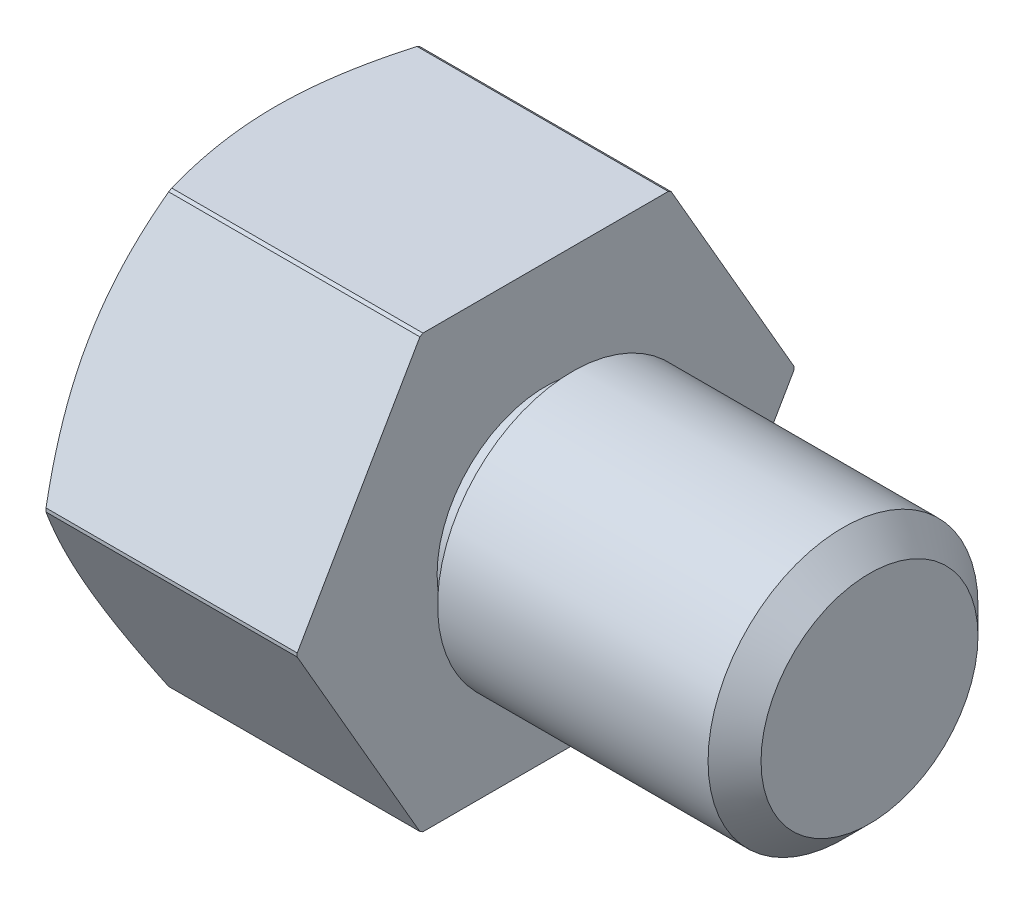
ISO-10303-21;
HEADER;
FILE_DESCRIPTION(('STEP AP214'),'2;1');
FILE_NAME('part.step','',(''),(''),'','','');
FILE_SCHEMA(('AUTOMOTIVE_DESIGN { 1 0 10303 214 1 1 1 1 }'));
ENDSEC;
DATA;
#1=APPLICATION_CONTEXT('core data for automotive mechanical design processes');
#2=APPLICATION_PROTOCOL_DEFINITION('international standard','automotive_design',2000,#1);
#3=PRODUCT_CONTEXT('',#1,'mechanical');
#4=PRODUCT('Part','Part','',(#3));
#5=PRODUCT_RELATED_PRODUCT_CATEGORY('part','',(#4));
#6=PRODUCT_DEFINITION_FORMATION('','',#4);
#7=PRODUCT_DEFINITION_CONTEXT('part definition',#1,'design');
#8=PRODUCT_DEFINITION('design','',#6,#7);
#9=PRODUCT_DEFINITION_SHAPE('','',#8);
#10=(LENGTH_UNIT() NAMED_UNIT(*) SI_UNIT(.MILLI.,.METRE.));
#11=(NAMED_UNIT(*) PLANE_ANGLE_UNIT() SI_UNIT($,.RADIAN.));
#12=(NAMED_UNIT(*) SI_UNIT($,.STERADIAN.) SOLID_ANGLE_UNIT());
#13=UNCERTAINTY_MEASURE_WITH_UNIT(LENGTH_MEASURE(1.E-05),#10,'distance_accuracy_value','');
#14=(GEOMETRIC_REPRESENTATION_CONTEXT(3) GLOBAL_UNCERTAINTY_ASSIGNED_CONTEXT((#13)) GLOBAL_UNIT_ASSIGNED_CONTEXT((#10,
#11,#12)) REPRESENTATION_CONTEXT('',''));
#15=CARTESIAN_POINT('',(0.,0.,0.));
#16=DIRECTION('',(0.,0.,1.));
#17=DIRECTION('',(1.,0.,0.));
#18=AXIS2_PLACEMENT_3D('',#15,#16,#17);
#19=CARTESIAN_POINT('',(6.,1.00475,0.));
#20=DIRECTION('',(1.,0.,0.));
#21=DIRECTION('',(0.,0.,-1.));
#22=AXIS2_PLACEMENT_3D('',#19,#20,#21);
#23=PLANE('',#22);
#24=CARTESIAN_POINT('',(6.00000000002865,0.,0.));
#25=DIRECTION('',(-1.,0.,0.));
#26=DIRECTION('',(0.,0.,1.));
#27=AXIS2_PLACEMENT_3D('',#24,#25,#26);
#28=CIRCLE('',#27,2.00949999998556);
#29=CARTESIAN_POINT('',(6.00000000002865,0.,2.00949999998556));
#30=VERTEX_POINT('',#29);
#31=EDGE_CURVE('E20',#30,#30,#28,.T.);
#32=ORIENTED_EDGE('',*,*,#31,.F.);
#33=EDGE_LOOP('',(#32));
#34=FACE_BOUND('',#33,.T.);
#35=ADVANCED_FACE('F17',(#34),#23,.T.);
#36=CARTESIAN_POINT('',(5.50950000007333,0.,0.));
#37=DIRECTION('',(-1.,0.,0.));
#38=DIRECTION('',(0.,0.,1.));
#39=AXIS2_PLACEMENT_3D('',#36,#37,#38);
#40=CONICAL_SURFACE('',#39,2.49999999999773,0.785398163455393);
#41=CARTESIAN_POINT('',(5.5095,0.,0.));
#42=DIRECTION('',(1.,0.,0.));
#43=DIRECTION('',(0.,0.,-1.));
#44=AXIS2_PLACEMENT_3D('',#41,#42,#43);
#45=CIRCLE('',#44,2.5);
#46=CARTESIAN_POINT('',(5.5095,0.,-2.5));
#47=VERTEX_POINT('',#46);
#48=EDGE_CURVE('E184',#47,#47,#45,.F.);
#49=ORIENTED_EDGE('',*,*,#48,.F.);
#50=EDGE_LOOP('',(#49));
#51=FACE_BOUND('',#50,.T.);
#52=ORIENTED_EDGE('',*,*,#31,.T.);
#53=EDGE_LOOP('',(#52));
#54=FACE_BOUND('',#53,.T.);
#55=ADVANCED_FACE('F341',(#51,#54),#40,.T.);
#56=CARTESIAN_POINT('',(3.00475,0.,0.));
#57=DIRECTION('',(1.,0.,0.));
#58=DIRECTION('',(0.,0.,-1.));
#59=AXIS2_PLACEMENT_3D('',#56,#57,#58);
#60=CYLINDRICAL_SURFACE('',#59,2.5);
#61=CARTESIAN_POINT('',(0.5,0.,0.));
#62=DIRECTION('',(1.,0.,0.));
#63=DIRECTION('',(0.,0.,-1.));
#64=AXIS2_PLACEMENT_3D('',#61,#62,#63);
#65=CIRCLE('',#64,2.5);
#66=CARTESIAN_POINT('',(0.5,0.,-2.5));
#67=VERTEX_POINT('',#66);
#68=EDGE_CURVE('E186',#67,#67,#65,.F.);
#69=ORIENTED_EDGE('',*,*,#68,.F.);
#70=EDGE_LOOP('',(#69));
#71=FACE_BOUND('',#70,.T.);
#72=ORIENTED_EDGE('',*,*,#48,.T.);
#73=EDGE_LOOP('',(#72));
#74=FACE_BOUND('',#73,.T.);
#75=ADVANCED_FACE('F338',(#71,#74),#60,.T.);
#76=CARTESIAN_POINT('',(0.5,2.25475,0.));
#77=DIRECTION('',(-1.,0.,0.));
#78=DIRECTION('',(0.,-1.,0.));
#79=AXIS2_PLACEMENT_3D('',#76,#77,#78);
#80=PLANE('',#79);
#81=ORIENTED_EDGE('',*,*,#68,.T.);
#82=EDGE_LOOP('',(#81));
#83=FACE_BOUND('',#82,.T.);
#84=CARTESIAN_POINT('',(0.5,0.,0.));
#85=DIRECTION('',(1.,0.,0.));
#86=DIRECTION('',(0.,0.,-1.));
#87=AXIS2_PLACEMENT_3D('',#84,#85,#86);
#88=CIRCLE('',#87,2.0095);
#89=CARTESIAN_POINT('',(0.5,0.,-2.0095));
#90=VERTEX_POINT('',#89);
#91=EDGE_CURVE('E181',#90,#90,#88,.F.);
#92=ORIENTED_EDGE('',*,*,#91,.F.);
#93=EDGE_LOOP('',(#92));
#94=FACE_BOUND('',#93,.T.);
#95=ADVANCED_FACE('F335',(#83,#94),#80,.T.);
#96=CARTESIAN_POINT('',(0.25,0.,0.));
#97=DIRECTION('',(1.,0.,0.));
#98=DIRECTION('',(0.,0.,-1.));
#99=AXIS2_PLACEMENT_3D('',#96,#97,#98);
#100=CYLINDRICAL_SURFACE('',#99,2.0095);
#101=CARTESIAN_POINT('',(0.,0.,0.));
#102=DIRECTION('',(1.,0.,0.));
#103=DIRECTION('',(0.,0.,-1.));
#104=AXIS2_PLACEMENT_3D('',#101,#102,#103);
#105=CIRCLE('',#104,2.0095);
#106=CARTESIAN_POINT('',(0.,0.,-2.0095));
#107=VERTEX_POINT('',#106);
#108=EDGE_CURVE('E153',#107,#107,#105,.F.);
#109=ORIENTED_EDGE('',*,*,#108,.F.);
#110=EDGE_LOOP('',(#109));
#111=FACE_BOUND('',#110,.T.);
#112=ORIENTED_EDGE('',*,*,#91,.T.);
#113=EDGE_LOOP('',(#112));
#114=FACE_BOUND('',#113,.T.);
#115=ADVANCED_FACE('F485',(#111,#114),#100,.T.);
#116=CARTESIAN_POINT('',(-2.32679491924311,0.,0.));
#117=DIRECTION('',(1.,0.,0.));
#118=DIRECTION('',(0.,0.,-1.));
#119=AXIS2_PLACEMENT_3D('',#116,#117,#118);
#120=CYLINDRICAL_SURFACE('',#119,4.6);
#121=DIRECTION('',(1.,0.,0.));
#122=VECTOR('',#121,1.);
#123=CARTESIAN_POINT('',(-5.,-0.0327684427093968,-4.59988328429781));
#124=LINE('',#123,#122);
#125=CARTESIAN_POINT('',(0.,-0.0327684427093948,-4.59988328429781));
#126=VERTEX_POINT('',#125);
#127=CARTESIAN_POINT('',(-4.65358983850798,-0.0327684427093944,-4.59988328429781));
#128=VERTEX_POINT('',#127);
#129=EDGE_CURVE('E182',#126,#128,#124,.F.);
#130=ORIENTED_EDGE('',*,*,#129,.T.);
#131=CARTESIAN_POINT('',(-4.65358983848622,0.,0.));
#132=DIRECTION('',(1.,0.,0.));
#133=DIRECTION('',(0.,0.,-1.));
#134=AXIS2_PLACEMENT_3D('',#131,#132,#133);
#135=CIRCLE('',#134,4.6);
#136=CARTESIAN_POINT('',(-4.65358983850798,0.0327684427094049,-4.59988328429781));
#137=VERTEX_POINT('',#136);
#138=EDGE_CURVE('E174',#128,#137,#135,.T.);
#139=ORIENTED_EDGE('',*,*,#138,.T.);
#140=DIRECTION('',(1.,0.,0.));
#141=VECTOR('',#140,1.);
#142=CARTESIAN_POINT('',(-5.,0.0327684427094017,-4.59988328429781));
#143=LINE('',#142,#141);
#144=CARTESIAN_POINT('',(0.,0.0327684427094049,-4.59988328429781));
#145=VERTEX_POINT('',#144);
#146=EDGE_CURVE('E137',#137,#145,#143,.T.);
#147=ORIENTED_EDGE('',*,*,#146,.T.);
#148=CARTESIAN_POINT('',(0.,0.,0.));
#149=DIRECTION('',(1.,0.,0.));
#150=DIRECTION('',(0.,0.,-1.));
#151=AXIS2_PLACEMENT_3D('',#148,#149,#150);
#152=CIRCLE('',#151,4.6);
#153=EDGE_CURVE('E134',#126,#145,#152,.T.);
#154=ORIENTED_EDGE('',*,*,#153,.F.);
#155=EDGE_LOOP('',(#130,#139,#147,#154));
#156=FACE_BOUND('',#155,.T.);
#157=ADVANCED_FACE('F396',(#156),#120,.T.);
#158=CARTESIAN_POINT('',(-2.32679491924311,0.,0.));
#159=DIRECTION('',(1.,0.,0.));
#160=DIRECTION('',(0.,0.,-1.));
#161=AXIS2_PLACEMENT_3D('',#158,#159,#160);
#162=CYLINDRICAL_SURFACE('',#161,4.6);
#163=DIRECTION('',(1.,0.,0.));
#164=VECTOR('',#163,1.);
#165=CARTESIAN_POINT('',(-5.,-3.9672315572906,-2.3283199459777));
#166=LINE('',#165,#164);
#167=CARTESIAN_POINT('',(-4.65358983850798,-3.9672315572906,-2.3283199459777));
#168=VERTEX_POINT('',#167);
#169=CARTESIAN_POINT('',(0.,-3.9672315572906,-2.3283199459777));
#170=VERTEX_POINT('',#169);
#171=EDGE_CURVE('E142',#168,#170,#166,.T.);
#172=ORIENTED_EDGE('',*,*,#171,.T.);
#173=CARTESIAN_POINT('',(0.,0.,0.));
#174=DIRECTION('',(1.,0.,0.));
#175=DIRECTION('',(0.,0.,-1.));
#176=AXIS2_PLACEMENT_3D('',#173,#174,#175);
#177=CIRCLE('',#176,4.6);
#178=CARTESIAN_POINT('',(0.,-4.,-2.27156333832011));
#179=VERTEX_POINT('',#178);
#180=EDGE_CURVE('E323',#179,#170,#177,.T.);
#181=ORIENTED_EDGE('',*,*,#180,.F.);
#182=DIRECTION('',(1.,0.,0.));
#183=VECTOR('',#182,1.);
#184=CARTESIAN_POINT('',(-5.,-4.,-2.27156333832011));
#185=LINE('',#184,#183);
#186=CARTESIAN_POINT('',(-4.65358983850798,-4.,-2.27156333832011));
#187=VERTEX_POINT('',#186);
#188=EDGE_CURVE('E178',#179,#187,#185,.F.);
#189=ORIENTED_EDGE('',*,*,#188,.T.);
#190=CARTESIAN_POINT('',(-4.65358983848622,0.,0.));
#191=DIRECTION('',(1.,0.,0.));
#192=DIRECTION('',(0.,0.,-1.));
#193=AXIS2_PLACEMENT_3D('',#190,#191,#192);
#194=CIRCLE('',#193,4.6);
#195=EDGE_CURVE('E167',#187,#168,#194,.T.);
#196=ORIENTED_EDGE('',*,*,#195,.T.);
#197=EDGE_LOOP('',(#172,#181,#189,#196));
#198=FACE_BOUND('',#197,.T.);
#199=ADVANCED_FACE('F470',(#198),#162,.T.);
#200=CARTESIAN_POINT('',(-2.32679491924311,0.,0.));
#201=DIRECTION('',(1.,0.,0.));
#202=DIRECTION('',(0.,0.,-1.));
#203=AXIS2_PLACEMENT_3D('',#200,#201,#202);
#204=CYLINDRICAL_SURFACE('',#203,4.6);
#205=DIRECTION('',(1.,0.,0.));
#206=VECTOR('',#205,1.);
#207=CARTESIAN_POINT('',(-5.,-4.,2.27156333832011));
#208=LINE('',#207,#206);
#209=CARTESIAN_POINT('',(-4.65358983850798,-4.,2.27156333832011));
#210=VERTEX_POINT('',#209);
#211=CARTESIAN_POINT('',(0.,-4.,2.27156333832011));
#212=VERTEX_POINT('',#211);
#213=EDGE_CURVE('E179',#210,#212,#208,.T.);
#214=ORIENTED_EDGE('',*,*,#213,.T.);
#215=CARTESIAN_POINT('',(0.,0.,0.));
#216=DIRECTION('',(1.,0.,0.));
#217=DIRECTION('',(0.,0.,-1.));
#218=AXIS2_PLACEMENT_3D('',#215,#216,#217);
#219=CIRCLE('',#218,4.6);
#220=CARTESIAN_POINT('',(0.,-3.9672315572906,2.32831994597771));
#221=VERTEX_POINT('',#220);
#222=EDGE_CURVE('E326',#221,#212,#219,.T.);
#223=ORIENTED_EDGE('',*,*,#222,.F.);
#224=DIRECTION('',(1.,0.,0.));
#225=VECTOR('',#224,1.);
#226=CARTESIAN_POINT('',(-5.,-3.9672315572906,2.3283199459777));
#227=LINE('',#226,#225);
#228=CARTESIAN_POINT('',(-4.65358983850798,-3.9672315572906,2.32831994597771));
#229=VERTEX_POINT('',#228);
#230=EDGE_CURVE('E171',#221,#229,#227,.F.);
#231=ORIENTED_EDGE('',*,*,#230,.T.);
#232=CARTESIAN_POINT('',(-4.65358983848622,0.,0.));
#233=DIRECTION('',(1.,0.,0.));
#234=DIRECTION('',(0.,0.,-1.));
#235=AXIS2_PLACEMENT_3D('',#232,#233,#234);
#236=CIRCLE('',#235,4.6);
#237=EDGE_CURVE('E165',#229,#210,#236,.T.);
#238=ORIENTED_EDGE('',*,*,#237,.T.);
#239=EDGE_LOOP('',(#214,#223,#231,#238));
#240=FACE_BOUND('',#239,.T.);
#241=ADVANCED_FACE('F463',(#240),#204,.T.);
#242=CARTESIAN_POINT('',(-2.32679491924311,0.,0.));
#243=DIRECTION('',(1.,0.,0.));
#244=DIRECTION('',(0.,0.,-1.));
#245=AXIS2_PLACEMENT_3D('',#242,#243,#244);
#246=CYLINDRICAL_SURFACE('',#245,4.6);
#247=DIRECTION('',(1.,0.,0.));
#248=VECTOR('',#247,1.);
#249=CARTESIAN_POINT('',(-5.,4.,-2.27156333832011));
#250=LINE('',#249,#248);
#251=CARTESIAN_POINT('',(-4.65358983850798,4.,-2.27156333832011));
#252=VERTEX_POINT('',#251);
#253=CARTESIAN_POINT('',(0.,4.,-2.27156333832011));
#254=VERTEX_POINT('',#253);
#255=EDGE_CURVE('E122',#252,#254,#250,.T.);
#256=ORIENTED_EDGE('',*,*,#255,.T.);
#257=CARTESIAN_POINT('',(0.,0.,0.));
#258=DIRECTION('',(1.,0.,0.));
#259=DIRECTION('',(0.,0.,-1.));
#260=AXIS2_PLACEMENT_3D('',#257,#258,#259);
#261=CIRCLE('',#260,4.6);
#262=CARTESIAN_POINT('',(0.,3.9672315572906,-2.32831994597771));
#263=VERTEX_POINT('',#262);
#264=EDGE_CURVE('E115',#263,#254,#261,.T.);
#265=ORIENTED_EDGE('',*,*,#264,.F.);
#266=DIRECTION('',(1.,0.,0.));
#267=VECTOR('',#266,1.);
#268=CARTESIAN_POINT('',(-5.,3.9672315572906,-2.3283199459777));
#269=LINE('',#268,#267);
#270=CARTESIAN_POINT('',(-4.65358983850798,3.9672315572906,-2.32831994597771));
#271=VERTEX_POINT('',#270);
#272=EDGE_CURVE('E119',#263,#271,#269,.F.);
#273=ORIENTED_EDGE('',*,*,#272,.T.);
#274=CARTESIAN_POINT('',(-4.65358983848622,0.,0.));
#275=DIRECTION('',(1.,0.,0.));
#276=DIRECTION('',(0.,0.,-1.));
#277=AXIS2_PLACEMENT_3D('',#274,#275,#276);
#278=CIRCLE('',#277,4.6);
#279=EDGE_CURVE('E160',#271,#252,#278,.T.);
#280=ORIENTED_EDGE('',*,*,#279,.T.);
#281=EDGE_LOOP('',(#256,#265,#273,#280));
#282=FACE_BOUND('',#281,.T.);
#283=ADVANCED_FACE('F117',(#282),#246,.T.);
#284=CARTESIAN_POINT('',(-2.32679491924311,0.,0.));
#285=DIRECTION('',(1.,0.,0.));
#286=DIRECTION('',(0.,0.,-1.));
#287=AXIS2_PLACEMENT_3D('',#284,#285,#286);
#288=CYLINDRICAL_SURFACE('',#287,4.6);
#289=DIRECTION('',(1.,0.,0.));
#290=VECTOR('',#289,1.);
#291=CARTESIAN_POINT('',(-5.,3.9672315572906,2.3283199459777));
#292=LINE('',#291,#290);
#293=CARTESIAN_POINT('',(-4.65358983850798,3.9672315572906,2.3283199459777));
#294=VERTEX_POINT('',#293);
#295=CARTESIAN_POINT('',(0.,3.9672315572906,2.3283199459777));
#296=VERTEX_POINT('',#295);
#297=EDGE_CURVE('E157',#294,#296,#292,.T.);
#298=ORIENTED_EDGE('',*,*,#297,.T.);
#299=CARTESIAN_POINT('',(0.,0.,0.));
#300=DIRECTION('',(1.,0.,0.));
#301=DIRECTION('',(0.,0.,-1.));
#302=AXIS2_PLACEMENT_3D('',#299,#300,#301);
#303=CIRCLE('',#302,4.6);
#304=CARTESIAN_POINT('',(0.,4.,2.27156333832011));
#305=VERTEX_POINT('',#304);
#306=EDGE_CURVE('E126',#305,#296,#303,.T.);
#307=ORIENTED_EDGE('',*,*,#306,.F.);
#308=DIRECTION('',(1.,0.,0.));
#309=VECTOR('',#308,1.);
#310=CARTESIAN_POINT('',(-5.,4.,2.27156333832011));
#311=LINE('',#310,#309);
#312=CARTESIAN_POINT('',(-4.65358983850798,4.,2.27156333832011));
#313=VERTEX_POINT('',#312);
#314=EDGE_CURVE('E163',#305,#313,#311,.F.);
#315=ORIENTED_EDGE('',*,*,#314,.T.);
#316=CARTESIAN_POINT('',(-4.65358983848622,0.,0.));
#317=DIRECTION('',(1.,0.,0.));
#318=DIRECTION('',(0.,0.,-1.));
#319=AXIS2_PLACEMENT_3D('',#316,#317,#318);
#320=CIRCLE('',#319,4.6);
#321=EDGE_CURVE('E127',#313,#294,#320,.T.);
#322=ORIENTED_EDGE('',*,*,#321,.T.);
#323=EDGE_LOOP('',(#298,#307,#315,#322));
#324=FACE_BOUND('',#323,.T.);
#325=ADVANCED_FACE('F411',(#324),#288,.T.);
#326=CARTESIAN_POINT('',(0.,3.30475,0.));
#327=DIRECTION('',(1.,0.,0.));
#328=DIRECTION('',(0.,0.,-1.));
#329=AXIS2_PLACEMENT_3D('',#326,#327,#328);
#330=PLANE('',#329);
#331=ORIENTED_EDGE('',*,*,#108,.T.);
#332=EDGE_LOOP('',(#331));
#333=FACE_BOUND('',#332,.T.);
#334=DIRECTION('',(0.,-0.866025403784439,0.5));
#335=VECTOR('',#334,1.);
#336=CARTESIAN_POINT('',(0.,-4.,-2.3094010767585));
#337=LINE('',#336,#335);
#338=EDGE_CURVE('E144',#170,#126,#337,.F.);
#339=ORIENTED_EDGE('',*,*,#338,.T.);
#340=ORIENTED_EDGE('',*,*,#153,.T.);
#341=DIRECTION('',(0.,-0.866025403784439,-0.5));
#342=VECTOR('',#341,1.);
#343=CARTESIAN_POINT('',(0.,0.,-4.61880215351701));
#344=LINE('',#343,#342);
#345=EDGE_CURVE('E131',#145,#263,#344,.F.);
#346=ORIENTED_EDGE('',*,*,#345,.T.);
#347=ORIENTED_EDGE('',*,*,#264,.T.);
#348=DIRECTION('',(0.,0.,-1.));
#349=VECTOR('',#348,1.);
#350=CARTESIAN_POINT('',(0.,4.,-2.3094010767585));
#351=LINE('',#350,#349);
#352=EDGE_CURVE('E161',#254,#305,#351,.F.);
#353=ORIENTED_EDGE('',*,*,#352,.T.);
#354=ORIENTED_EDGE('',*,*,#306,.T.);
#355=DIRECTION('',(0.,0.866025403784439,-0.5));
#356=VECTOR('',#355,1.);
#357=CARTESIAN_POINT('',(0.,4.,2.3094010767585));
#358=LINE('',#357,#356);
#359=CARTESIAN_POINT('',(0.,0.0327684427093948,4.59988328429781));
#360=VERTEX_POINT('',#359);
#361=EDGE_CURVE('E154',#296,#360,#358,.F.);
#362=ORIENTED_EDGE('',*,*,#361,.T.);
#363=CARTESIAN_POINT('',(0.,0.,0.));
#364=DIRECTION('',(1.,0.,0.));
#365=DIRECTION('',(0.,0.,-1.));
#366=AXIS2_PLACEMENT_3D('',#363,#364,#365);
#367=CIRCLE('',#366,4.6);
#368=CARTESIAN_POINT('',(0.,-0.0327684427094049,4.59988328429781));
#369=VERTEX_POINT('',#368);
#370=EDGE_CURVE('E149',#369,#360,#367,.F.);
#371=ORIENTED_EDGE('',*,*,#370,.F.);
#372=DIRECTION('',(0.,0.866025403784439,0.5));
#373=VECTOR('',#372,1.);
#374=CARTESIAN_POINT('',(0.,0.,4.61880215351701));
#375=LINE('',#374,#373);
#376=EDGE_CURVE('E168',#369,#221,#375,.F.);
#377=ORIENTED_EDGE('',*,*,#376,.T.);
#378=ORIENTED_EDGE('',*,*,#222,.T.);
#379=DIRECTION('',(0.,0.,1.));
#380=VECTOR('',#379,1.);
#381=CARTESIAN_POINT('',(0.,-4.,2.3094010767585));
#382=LINE('',#381,#380);
#383=EDGE_CURVE('E175',#212,#179,#382,.F.);
#384=ORIENTED_EDGE('',*,*,#383,.T.);
#385=ORIENTED_EDGE('',*,*,#180,.T.);
#386=EDGE_LOOP('',(#339,#340,#346,#347,#353,#354,#362,#371,#377,#378,#384,#385));
#387=FACE_BOUND('',#386,.T.);
#388=ADVANCED_FACE('F133',(#333,#387),#330,.T.);
#389=CARTESIAN_POINT('',(-2.32679491924311,0.,0.));
#390=DIRECTION('',(1.,0.,0.));
#391=DIRECTION('',(0.,0.,-1.));
#392=AXIS2_PLACEMENT_3D('',#389,#390,#391);
#393=CYLINDRICAL_SURFACE('',#392,4.6);
#394=DIRECTION('',(1.,0.,0.));
#395=VECTOR('',#394,1.);
#396=CARTESIAN_POINT('',(-5.,-0.0327684427094017,4.59988328429781));
#397=LINE('',#396,#395);
#398=CARTESIAN_POINT('',(-4.65358983850798,-0.0327684427094049,4.59988328429781));
#399=VERTEX_POINT('',#398);
#400=EDGE_CURVE('E172',#399,#369,#397,.T.);
#401=ORIENTED_EDGE('',*,*,#400,.T.);
#402=ORIENTED_EDGE('',*,*,#370,.T.);
#403=DIRECTION('',(1.,0.,0.));
#404=VECTOR('',#403,1.);
#405=CARTESIAN_POINT('',(-5.,0.0327684427093968,4.59988328429781));
#406=LINE('',#405,#404);
#407=CARTESIAN_POINT('',(-4.65358983850798,0.0327684427093944,4.59988328429781));
#408=VERTEX_POINT('',#407);
#409=EDGE_CURVE('E156',#360,#408,#406,.F.);
#410=ORIENTED_EDGE('',*,*,#409,.T.);
#411=CARTESIAN_POINT('',(-4.65358983848622,0.,0.));
#412=DIRECTION('',(1.,0.,0.));
#413=DIRECTION('',(0.,0.,-1.));
#414=AXIS2_PLACEMENT_3D('',#411,#412,#413);
#415=CIRCLE('',#414,4.6);
#416=EDGE_CURVE('E150',#408,#399,#415,.T.);
#417=ORIENTED_EDGE('',*,*,#416,.T.);
#418=EDGE_LOOP('',(#401,#402,#410,#417));
#419=FACE_BOUND('',#418,.T.);
#420=ADVANCED_FACE('F311',(#419),#393,.T.);
#421=CARTESIAN_POINT('',(-5.,0.,-4.61880215351701));
#422=DIRECTION('',(0.,-0.5,0.866025403784439));
#423=DIRECTION('',(0.,-0.866025403784439,-0.5));
#424=AXIS2_PLACEMENT_3D('',#421,#422,#423);
#425=PLANE('',#424);
#426=ORIENTED_EDGE('',*,*,#345,.F.);
#427=ORIENTED_EDGE('',*,*,#146,.F.);
#428=CARTESIAN_POINT('',(-5.0000000000305,2.,-3.46410161513776));
#429=CARTESIAN_POINT('',(-5.00001528986816,1.91654472047546,-3.51228454323655));
#430=CARTESIAN_POINT('',(-4.9979898046386,1.83309320888606,-3.56046529591697));
#431=CARTESIAN_POINT('',(-4.98997086319413,1.66634813859431,-3.65673560713595));
#432=CARTESIAN_POINT('',(-4.98397814177449,1.58305455350595,-3.70482518090849));
#433=CARTESIAN_POINT('',(-4.96817687574668,1.41715051497203,-3.80060992221569));
#434=CARTESIAN_POINT('',(-4.95838709374606,1.33453871138651,-3.84830586925403));
#435=CARTESIAN_POINT('',(-4.93519618318754,1.16969719535746,-3.94347716290703));
#436=CARTESIAN_POINT('',(-4.92179496833987,1.0874674920914,-3.99095250422307));
#437=CARTESIAN_POINT('',(-4.87657493972515,0.841679659429174,-4.13285817557415));
#438=CARTESIAN_POINT('',(-4.83971891571733,0.67881601228033,-4.22688754609674));
#439=CARTESIAN_POINT('',(-4.75463489377108,0.354462902246475,-4.41415290148727));
#440=CARTESIAN_POINT('',(-4.70635141415433,0.192984257514146,-4.50738264049186));
#441=CARTESIAN_POINT('',(-4.65358983852806,0.0327684427042984,-4.59988328430076));
#442=B_SPLINE_CURVE_WITH_KNOTS('',3,(#428,#429,#430,#431,#432,#433,#434,#435,#436,#437,#438,
#439,#440,#441),.UNSPECIFIED.,.F.,.F.,(4,2,2,2,2,2,4),(0.,0.289069278709474,0.578085032162395,
0.865690487406914,1.15330281516142,1.72781024307661,2.30516636160525),.UNSPECIFIED.);
#443=CARTESIAN_POINT('',(-5.0000000000414,1.99999999999057,-3.46410161512141));
#444=VERTEX_POINT('',#443);
#445=EDGE_CURVE('E297',#444,#137,#442,.T.);
#446=ORIENTED_EDGE('',*,*,#445,.F.);
#447=CARTESIAN_POINT('',(-4.65358983852806,3.9672315572957,-2.32831994597476));
#448=CARTESIAN_POINT('',(-4.70635141415433,3.80701574248586,-2.42082058978366));
#449=CARTESIAN_POINT('',(-4.75463489377108,3.64553709775353,-2.51405032878824));
#450=CARTESIAN_POINT('',(-4.83971891571733,3.32118398771968,-2.70131568417878));
#451=CARTESIAN_POINT('',(-4.87657493972514,3.15832034057083,-2.79534505470137));
#452=CARTESIAN_POINT('',(-4.92179496833987,2.91253250790861,-2.93725072605244));
#453=CARTESIAN_POINT('',(-4.93519618318754,2.83030280464255,-2.98472606736848));
#454=CARTESIAN_POINT('',(-4.95838709374606,2.6654612886135,-3.07989736102148));
#455=CARTESIAN_POINT('',(-4.96817687574668,2.58284948502797,-3.12759330805982));
#456=CARTESIAN_POINT('',(-4.98397814177449,2.41694544649406,-3.22337804936703));
#457=CARTESIAN_POINT('',(-4.98997086319413,2.3336518614057,-3.27146762313956));
#458=CARTESIAN_POINT('',(-4.99798980463861,2.16690679111395,-3.36773793435854));
#459=CARTESIAN_POINT('',(-5.00001528986816,2.08345527952455,-3.41591868703896));
#460=CARTESIAN_POINT('',(-5.0000000000305,2.00000000000001,-3.46410161513776));
#461=B_SPLINE_CURVE_WITH_KNOTS('',3,(#447,#448,#449,#450,#451,#452,#453,#454,#455,#456,#457,
#458,#459,#460),.UNSPECIFIED.,.F.,.F.,(4,2,2,2,2,2,4),(0.,0.577356118528637,1.15186354644382,
1.43947587419833,1.72708132944284,2.01609708289577,2.30516636160524),.UNSPECIFIED.);
#462=EDGE_CURVE('E141',#271,#444,#461,.T.);
#463=ORIENTED_EDGE('',*,*,#462,.F.);
#464=ORIENTED_EDGE('',*,*,#272,.F.);
#465=EDGE_LOOP('',(#426,#427,#446,#463,#464));
#466=FACE_BOUND('',#465,.T.);
#467=ADVANCED_FACE('F139',(#466),#425,.F.);
#468=CARTESIAN_POINT('',(-5.,-4.,-2.3094010767585));
#469=DIRECTION('',(0.,0.5,0.866025403784439));
#470=DIRECTION('',(0.,-0.866025403784439,0.5));
#471=AXIS2_PLACEMENT_3D('',#468,#469,#470);
#472=PLANE('',#471);
#473=ORIENTED_EDGE('',*,*,#338,.F.);
#474=ORIENTED_EDGE('',*,*,#171,.F.);
#475=CARTESIAN_POINT('',(-5.00000000003051,-2.,-3.46410161513775));
#476=CARTESIAN_POINT('',(-5.00001528986817,-2.08345527952454,-3.41591868703896));
#477=CARTESIAN_POINT('',(-4.99798980463861,-2.16690679111394,-3.36773793435854));
#478=CARTESIAN_POINT('',(-4.98997086319414,-2.33365186140569,-3.27146762313956));
#479=CARTESIAN_POINT('',(-4.98397814177449,-2.41694544649405,-3.22337804936702));
#480=CARTESIAN_POINT('',(-4.96817687574668,-2.58284948502797,-3.12759330805982));
#481=CARTESIAN_POINT('',(-4.95838709374607,-2.66546128861349,-3.07989736102148));
#482=CARTESIAN_POINT('',(-4.93519618318755,-2.83030280464255,-2.98472606736848));
#483=CARTESIAN_POINT('',(-4.92179496833987,-2.9125325079086,-2.93725072605244));
#484=CARTESIAN_POINT('',(-4.87657493972515,-3.15832034057083,-2.79534505470137));
#485=CARTESIAN_POINT('',(-4.83971891571734,-3.32118398771967,-2.70131568417878));
#486=CARTESIAN_POINT('',(-4.75463489377108,-3.64553709775353,-2.51405032878824));
#487=CARTESIAN_POINT('',(-4.70635141415433,-3.80701574248585,-2.42082058978365));
#488=CARTESIAN_POINT('',(-4.65358983852806,-3.9672315572957,-2.32831994597475));
#489=B_SPLINE_CURVE_WITH_KNOTS('',3,(#475,#476,#477,#478,#479,#480,#481,#482,#483,#484,#485,
#486,#487,#488),.UNSPECIFIED.,.F.,.F.,(4,2,2,2,2,2,4),(0.,0.289069278709474,0.578085032162395,
0.865690487406914,1.15330281516142,1.72781024307661,2.30516636160525),.UNSPECIFIED.);
#490=CARTESIAN_POINT('',(-5.0000000000414,-1.99999999999056,-3.46410161512141));
#491=VERTEX_POINT('',#490);
#492=EDGE_CURVE('E275',#491,#168,#489,.T.);
#493=ORIENTED_EDGE('',*,*,#492,.F.);
#494=CARTESIAN_POINT('',(-4.65358983852806,-0.0327684427042943,-4.59988328430075));
#495=CARTESIAN_POINT('',(-4.70635141415433,-0.192984257514142,-4.50738264049185));
#496=CARTESIAN_POINT('',(-4.75463489377108,-0.35446290224647,-4.41415290148727));
#497=CARTESIAN_POINT('',(-4.83971891571734,-0.678816012280325,-4.22688754609673));
#498=CARTESIAN_POINT('',(-4.87657493972515,-0.841679659429169,-4.13285817557414));
#499=CARTESIAN_POINT('',(-4.92179496833987,-1.08746749209139,-3.99095250422307));
#500=CARTESIAN_POINT('',(-4.93519618318755,-1.16969719535745,-3.94347716290703));
#501=CARTESIAN_POINT('',(-4.95838709374607,-1.3345387113865,-3.84830586925403));
#502=CARTESIAN_POINT('',(-4.96817687574668,-1.41715051497203,-3.80060992221569));
#503=CARTESIAN_POINT('',(-4.98397814177449,-1.58305455350594,-3.70482518090848));
#504=CARTESIAN_POINT('',(-4.98997086319414,-1.6663481385943,-3.65673560713595));
#505=CARTESIAN_POINT('',(-4.99798980463861,-1.83309320888605,-3.56046529591696));
#506=CARTESIAN_POINT('',(-5.00001528986817,-1.91654472047545,-3.51228454323655));
#507=CARTESIAN_POINT('',(-5.00000000003051,-2.,-3.46410161513775));
#508=B_SPLINE_CURVE_WITH_KNOTS('',3,(#494,#495,#496,#497,#498,#499,#500,#501,#502,#503,#504,
#505,#506,#507),.UNSPECIFIED.,.F.,.F.,(4,2,2,2,2,2,4),(0.,0.577356118528638,1.15186354644382,
1.43947587419833,1.72708132944285,2.01609708289577,2.30516636160524),.UNSPECIFIED.);
#509=EDGE_CURVE('E276',#128,#491,#508,.T.);
#510=ORIENTED_EDGE('',*,*,#509,.F.);
#511=ORIENTED_EDGE('',*,*,#129,.F.);
#512=EDGE_LOOP('',(#473,#474,#493,#510,#511));
#513=FACE_BOUND('',#512,.T.);
#514=ADVANCED_FACE('F262',(#513),#472,.F.);
#515=CARTESIAN_POINT('',(-5.,-4.,2.3094010767585));
#516=DIRECTION('',(0.,1.,0.));
#517=DIRECTION('',(0.,0.,1.));
#518=AXIS2_PLACEMENT_3D('',#515,#516,#517);
#519=PLANE('',#518);
#520=ORIENTED_EDGE('',*,*,#383,.F.);
#521=ORIENTED_EDGE('',*,*,#213,.F.);
#522=CARTESIAN_POINT('',(-5.0000000000305,-4.,0.));
#523=CARTESIAN_POINT('',(-5.00001528986816,-4.,0.0963658561975864));
#524=CARTESIAN_POINT('',(-4.99798980463861,-4.,0.192727361558425));
#525=CARTESIAN_POINT('',(-4.98997086319414,-4.,0.385267983996394));
#526=CARTESIAN_POINT('',(-4.98397814177449,-4.,0.481447131541464));
#527=CARTESIAN_POINT('',(-4.96817687574668,-4.,0.673016614155867));
#528=CARTESIAN_POINT('',(-4.95838709374607,-4.,0.768408508232552));
#529=CARTESIAN_POINT('',(-4.93519618318755,-4.,0.958751095538553));
#530=CARTESIAN_POINT('',(-4.92179496833987,-4.,1.05370177817063));
#531=CARTESIAN_POINT('',(-4.87657493972515,-4.,1.33751312087277));
#532=CARTESIAN_POINT('',(-4.83971891571733,-4.,1.52557186191795));
#533=CARTESIAN_POINT('',(-4.75463489377108,-4.,1.90010257269903));
#534=CARTESIAN_POINT('',(-4.70635141415433,-4.,2.0865620507082));
#535=CARTESIAN_POINT('',(-4.65358983852806,-4.,2.271563338326));
#536=B_SPLINE_CURVE_WITH_KNOTS('',3,(#522,#523,#524,#525,#526,#527,#528,#529,#530,#531,#532,
#533,#534,#535),.UNSPECIFIED.,.F.,.F.,(4,2,2,2,2,2,4),(0.,0.289069278709474,0.578085032162395,
0.865690487406913,1.15330281516142,1.7278102430766,2.30516636160524),.UNSPECIFIED.);
#537=CARTESIAN_POINT('',(-5.0000000000414,-3.99999999998113,0.));
#538=VERTEX_POINT('',#537);
#539=EDGE_CURVE('E245',#538,#210,#536,.T.);
#540=ORIENTED_EDGE('',*,*,#539,.F.);
#541=CARTESIAN_POINT('',(-4.65358983852806,-4.,-2.271563338326));
#542=CARTESIAN_POINT('',(-4.70635141415433,-4.,-2.0865620507082));
#543=CARTESIAN_POINT('',(-4.75463489377108,-4.,-1.90010257269903));
#544=CARTESIAN_POINT('',(-4.83971891571733,-4.,-1.52557186191795));
#545=CARTESIAN_POINT('',(-4.87657493972515,-4.,-1.33751312087277));
#546=CARTESIAN_POINT('',(-4.92179496833987,-4.,-1.05370177817063));
#547=CARTESIAN_POINT('',(-4.93519618318755,-4.,-0.958751095538552));
#548=CARTESIAN_POINT('',(-4.95838709374607,-4.,-0.768408508232551));
#549=CARTESIAN_POINT('',(-4.96817687574668,-4.,-0.673016614155866));
#550=CARTESIAN_POINT('',(-4.98397814177449,-4.,-0.481447131541463));
#551=CARTESIAN_POINT('',(-4.98997086319414,-4.,-0.385267983996393));
#552=CARTESIAN_POINT('',(-4.99798980463861,-4.,-0.192727361558424));
#553=CARTESIAN_POINT('',(-5.00001528986816,-4.,-0.0963658561975856));
#554=CARTESIAN_POINT('',(-5.0000000000305,-4.,0.));
#555=B_SPLINE_CURVE_WITH_KNOTS('',3,(#541,#542,#543,#544,#545,#546,#547,#548,#549,#550,#551,
#552,#553,#554),.UNSPECIFIED.,.F.,.F.,(4,2,2,2,2,2,4),(0.,0.577356118528639,1.15186354644382,
1.43947587419833,1.72708132944285,2.01609708289577,2.30516636160524),.UNSPECIFIED.);
#556=EDGE_CURVE('E269',#187,#538,#555,.T.);
#557=ORIENTED_EDGE('',*,*,#556,.F.);
#558=ORIENTED_EDGE('',*,*,#188,.F.);
#559=EDGE_LOOP('',(#520,#521,#540,#557,#558));
#560=FACE_BOUND('',#559,.T.);
#561=ADVANCED_FACE('F257',(#560),#519,.F.);
#562=CARTESIAN_POINT('',(-5.,0.,4.61880215351701));
#563=DIRECTION('',(0.,0.5,-0.866025403784439));
#564=DIRECTION('',(0.,0.866025403784439,0.5));
#565=AXIS2_PLACEMENT_3D('',#562,#563,#564);
#566=PLANE('',#565);
#567=ORIENTED_EDGE('',*,*,#376,.F.);
#568=ORIENTED_EDGE('',*,*,#400,.F.);
#569=CARTESIAN_POINT('',(-5.0000000000305,-2.,3.46410161513776));
#570=CARTESIAN_POINT('',(-5.00001528986816,-1.91654472047546,3.51228454323655));
#571=CARTESIAN_POINT('',(-4.99798980463861,-1.83309320888606,3.56046529591697));
#572=CARTESIAN_POINT('',(-4.98997086319413,-1.66634813859431,3.65673560713595));
#573=CARTESIAN_POINT('',(-4.98397814177449,-1.58305455350595,3.70482518090849));
#574=CARTESIAN_POINT('',(-4.96817687574668,-1.41715051497203,3.80060992221569));
#575=CARTESIAN_POINT('',(-4.95838709374606,-1.33453871138651,3.84830586925403));
#576=CARTESIAN_POINT('',(-4.93519618318754,-1.16969719535746,3.94347716290703));
#577=CARTESIAN_POINT('',(-4.92179496833987,-1.0874674920914,3.99095250422307));
#578=CARTESIAN_POINT('',(-4.87657493972515,-0.841679659429174,4.13285817557414));
#579=CARTESIAN_POINT('',(-4.83971891571733,-0.678816012280329,4.22688754609673));
#580=CARTESIAN_POINT('',(-4.75463489377108,-0.354462902246475,4.41415290148727));
#581=CARTESIAN_POINT('',(-4.70635141415433,-0.192984257514146,4.50738264049186));
#582=CARTESIAN_POINT('',(-4.65358983852806,-0.0327684427042984,4.59988328430076));
#583=B_SPLINE_CURVE_WITH_KNOTS('',3,(#569,#570,#571,#572,#573,#574,#575,#576,#577,#578,#579,
#580,#581,#582),.UNSPECIFIED.,.F.,.F.,(4,2,2,2,2,2,4),(0.,0.289069278709474,0.578085032162395,
0.865690487406913,1.15330281516142,1.72781024307661,2.30516636160524),.UNSPECIFIED.);
#584=CARTESIAN_POINT('',(-5.0000000000414,-1.99999999999057,3.46410161512141));
#585=VERTEX_POINT('',#584);
#586=EDGE_CURVE('E234',#585,#399,#583,.T.);
#587=ORIENTED_EDGE('',*,*,#586,.F.);
#588=CARTESIAN_POINT('',(-4.65358983852806,-3.9672315572957,2.32831994597476));
#589=CARTESIAN_POINT('',(-4.70635141415433,-3.80701574248586,2.42082058978366));
#590=CARTESIAN_POINT('',(-4.75463489377108,-3.64553709775353,2.51405032878824));
#591=CARTESIAN_POINT('',(-4.83971891571733,-3.32118398771967,2.70131568417878));
#592=CARTESIAN_POINT('',(-4.87657493972515,-3.15832034057083,2.79534505470137));
#593=CARTESIAN_POINT('',(-4.92179496833987,-2.91253250790861,2.93725072605244));
#594=CARTESIAN_POINT('',(-4.93519618318754,-2.83030280464255,2.98472606736848));
#595=CARTESIAN_POINT('',(-4.95838709374606,-2.6654612886135,3.07989736102148));
#596=CARTESIAN_POINT('',(-4.96817687574668,-2.58284948502797,3.12759330805983));
#597=CARTESIAN_POINT('',(-4.98397814177449,-2.41694544649406,3.22337804936703));
#598=CARTESIAN_POINT('',(-4.98997086319413,-2.3336518614057,3.27146762313956));
#599=CARTESIAN_POINT('',(-4.99798980463861,-2.16690679111395,3.36773793435855));
#600=CARTESIAN_POINT('',(-5.00001528986816,-2.08345527952455,3.41591868703896));
#601=CARTESIAN_POINT('',(-5.0000000000305,-2.,3.46410161513776));
#602=B_SPLINE_CURVE_WITH_KNOTS('',3,(#588,#589,#590,#591,#592,#593,#594,#595,#596,#597,#598,
#599,#600,#601),.UNSPECIFIED.,.F.,.F.,(4,2,2,2,2,2,4),(0.,0.577356118528637,1.15186354644382,
1.43947587419833,1.72708132944285,2.01609708289577,2.30516636160524),.UNSPECIFIED.);
#603=EDGE_CURVE('E252',#229,#585,#602,.T.);
#604=ORIENTED_EDGE('',*,*,#603,.F.);
#605=ORIENTED_EDGE('',*,*,#230,.F.);
#606=EDGE_LOOP('',(#567,#568,#587,#604,#605));
#607=FACE_BOUND('',#606,.T.);
#608=ADVANCED_FACE('F261',(#607),#566,.F.);
#609=CARTESIAN_POINT('',(-5.,4.,-2.3094010767585));
#610=DIRECTION('',(0.,-1.,0.));
#611=DIRECTION('',(0.,0.,-1.));
#612=AXIS2_PLACEMENT_3D('',#609,#610,#611);
#613=PLANE('',#612);
#614=ORIENTED_EDGE('',*,*,#352,.F.);
#615=ORIENTED_EDGE('',*,*,#255,.F.);
#616=CARTESIAN_POINT('',(-5.0000000000305,4.,0.));
#617=CARTESIAN_POINT('',(-5.00001528986816,4.,-0.0963658561975869));
#618=CARTESIAN_POINT('',(-4.99798980463861,4.,-0.192727361558425));
#619=CARTESIAN_POINT('',(-4.98997086319414,4.,-0.385267983996395));
#620=CARTESIAN_POINT('',(-4.98397814177449,4.,-0.481447131541465));
#621=CARTESIAN_POINT('',(-4.96817687574668,4.,-0.673016614155867));
#622=CARTESIAN_POINT('',(-4.95838709374607,4.,-0.768408508232552));
#623=CARTESIAN_POINT('',(-4.93519618318755,4.,-0.958751095538553));
#624=CARTESIAN_POINT('',(-4.92179496833987,4.,-1.05370177817063));
#625=CARTESIAN_POINT('',(-4.87657493972515,4.,-1.33751312087277));
#626=CARTESIAN_POINT('',(-4.83971891571733,4.,-1.52557186191795));
#627=CARTESIAN_POINT('',(-4.75463489377108,4.,-1.90010257269903));
#628=CARTESIAN_POINT('',(-4.70635141415433,4.,-2.0865620507082));
#629=CARTESIAN_POINT('',(-4.65358983852806,4.,-2.271563338326));
#630=B_SPLINE_CURVE_WITH_KNOTS('',3,(#616,#617,#618,#619,#620,#621,#622,#623,#624,#625,#626,
#627,#628,#629),.UNSPECIFIED.,.F.,.F.,(4,2,2,2,2,2,4),(0.,0.289069278709473,0.578085032162394,
0.865690487406912,1.15330281516142,1.7278102430766,2.30516636160524),.UNSPECIFIED.);
#631=CARTESIAN_POINT('',(-5.0000000000414,3.99999999998113,0.));
#632=VERTEX_POINT('',#631);
#633=EDGE_CURVE('E303',#632,#252,#630,.T.);
#634=ORIENTED_EDGE('',*,*,#633,.F.);
#635=CARTESIAN_POINT('',(-4.65358983852806,4.,2.271563338326));
#636=CARTESIAN_POINT('',(-4.70635141415433,4.,2.0865620507082));
#637=CARTESIAN_POINT('',(-4.75463489377108,4.,1.90010257269903));
#638=CARTESIAN_POINT('',(-4.83971891571733,4.,1.52557186191795));
#639=CARTESIAN_POINT('',(-4.87657493972515,4.,1.33751312087277));
#640=CARTESIAN_POINT('',(-4.92179496833987,4.,1.05370177817063));
#641=CARTESIAN_POINT('',(-4.93519618318755,4.,0.958751095538552));
#642=CARTESIAN_POINT('',(-4.95838709374607,4.,0.768408508232551));
#643=CARTESIAN_POINT('',(-4.96817687574668,4.,0.673016614155866));
#644=CARTESIAN_POINT('',(-4.98397814177449,4.,0.481447131541463));
#645=CARTESIAN_POINT('',(-4.98997086319414,4.,0.385267983996393));
#646=CARTESIAN_POINT('',(-4.99798980463861,4.,0.192727361558423));
#647=CARTESIAN_POINT('',(-5.00001528986816,4.,0.0963658561975851));
#648=CARTESIAN_POINT('',(-5.0000000000305,4.,0.));
#649=B_SPLINE_CURVE_WITH_KNOTS('',3,(#635,#636,#637,#638,#639,#640,#641,#642,#643,#644,#645,
#646,#647,#648),.UNSPECIFIED.,.F.,.F.,(4,2,2,2,2,2,4),(0.,0.577356118528639,1.15186354644382,
1.43947587419833,1.72708132944285,2.01609708289577,2.30516636160524),.UNSPECIFIED.);
#650=EDGE_CURVE('E208',#313,#632,#649,.T.);
#651=ORIENTED_EDGE('',*,*,#650,.F.);
#652=ORIENTED_EDGE('',*,*,#314,.F.);
#653=EDGE_LOOP('',(#614,#615,#634,#651,#652));
#654=FACE_BOUND('',#653,.T.);
#655=ADVANCED_FACE('F373',(#654),#613,.F.);
#656=CARTESIAN_POINT('',(-5.,4.,2.3094010767585));
#657=DIRECTION('',(0.,-0.5,-0.866025403784439));
#658=DIRECTION('',(0.,0.866025403784439,-0.5));
#659=AXIS2_PLACEMENT_3D('',#656,#657,#658);
#660=PLANE('',#659);
#661=ORIENTED_EDGE('',*,*,#361,.F.);
#662=ORIENTED_EDGE('',*,*,#297,.F.);
#663=CARTESIAN_POINT('',(-5.00000000003051,2.,3.46410161513775));
#664=CARTESIAN_POINT('',(-5.00001528986816,2.08345527952454,3.41591868703896));
#665=CARTESIAN_POINT('',(-4.99798980463861,2.16690679111394,3.36773793435854));
#666=CARTESIAN_POINT('',(-4.98997086319414,2.33365186140569,3.27146762313956));
#667=CARTESIAN_POINT('',(-4.98397814177449,2.41694544649405,3.22337804936702));
#668=CARTESIAN_POINT('',(-4.96817687574668,2.58284948502797,3.12759330805982));
#669=CARTESIAN_POINT('',(-4.95838709374607,2.66546128861349,3.07989736102148));
#670=CARTESIAN_POINT('',(-4.93519618318755,2.83030280464254,2.98472606736848));
#671=CARTESIAN_POINT('',(-4.92179496833987,2.9125325079086,2.93725072605244));
#672=CARTESIAN_POINT('',(-4.87657493972515,3.15832034057083,2.79534505470137));
#673=CARTESIAN_POINT('',(-4.83971891571734,3.32118398771967,2.70131568417878));
#674=CARTESIAN_POINT('',(-4.75463489377108,3.64553709775353,2.51405032878824));
#675=CARTESIAN_POINT('',(-4.70635141415433,3.80701574248585,2.42082058978365));
#676=CARTESIAN_POINT('',(-4.65358983852806,3.9672315572957,2.32831994597475));
#677=B_SPLINE_CURVE_WITH_KNOTS('',3,(#663,#664,#665,#666,#667,#668,#669,#670,#671,#672,#673,
#674,#675,#676),.UNSPECIFIED.,.F.,.F.,(4,2,2,2,2,2,4),(0.,0.289069278709474,0.578085032162396,
0.865690487406914,1.15330281516142,1.72781024307661,2.30516636160525),.UNSPECIFIED.);
#678=CARTESIAN_POINT('',(-5.0000000000414,1.99999999999056,3.46410161512141));
#679=VERTEX_POINT('',#678);
#680=EDGE_CURVE('E35',#679,#294,#677,.T.);
#681=ORIENTED_EDGE('',*,*,#680,.F.);
#682=CARTESIAN_POINT('',(-4.65358983852806,0.0327684427042943,4.59988328430075));
#683=CARTESIAN_POINT('',(-4.70635141415433,0.192984257514141,4.50738264049185));
#684=CARTESIAN_POINT('',(-4.75463489377108,0.354462902246469,4.41415290148727));
#685=CARTESIAN_POINT('',(-4.83971891571734,0.678816012280324,4.22688754609673));
#686=CARTESIAN_POINT('',(-4.87657493972515,0.841679659429168,4.13285817557414));
#687=CARTESIAN_POINT('',(-4.92179496833987,1.08746749209139,3.99095250422307));
#688=CARTESIAN_POINT('',(-4.93519618318755,1.16969719535745,3.94347716290703));
#689=CARTESIAN_POINT('',(-4.95838709374607,1.3345387113865,3.84830586925403));
#690=CARTESIAN_POINT('',(-4.96817687574668,1.41715051497203,3.80060992221569));
#691=CARTESIAN_POINT('',(-4.98397814177449,1.58305455350594,3.70482518090848));
#692=CARTESIAN_POINT('',(-4.98997086319414,1.6663481385943,3.65673560713595));
#693=CARTESIAN_POINT('',(-4.99798980463861,1.83309320888605,3.56046529591696));
#694=CARTESIAN_POINT('',(-5.00001528986817,1.91654472047545,3.51228454323655));
#695=CARTESIAN_POINT('',(-5.00000000003051,2.,3.46410161513775));
#696=B_SPLINE_CURVE_WITH_KNOTS('',3,(#682,#683,#684,#685,#686,#687,#688,#689,#690,#691,#692,
#693,#694,#695),.UNSPECIFIED.,.F.,.F.,(4,2,2,2,2,2,4),(0.,0.577356118528638,1.15186354644382,
1.43947587419833,1.72708132944285,2.01609708289577,2.30516636160524),.UNSPECIFIED.);
#697=EDGE_CURVE('E240',#408,#679,#696,.T.);
#698=ORIENTED_EDGE('',*,*,#697,.F.);
#699=ORIENTED_EDGE('',*,*,#409,.F.);
#700=EDGE_LOOP('',(#661,#662,#681,#698,#699));
#701=FACE_BOUND('',#700,.T.);
#702=ADVANCED_FACE('F214',(#701),#660,.F.);
#703=CARTESIAN_POINT('',(-4.65358983854003,0.,0.));
#704=DIRECTION('',(1.,0.,0.));
#705=DIRECTION('',(0.,0.,-1.));
#706=AXIS2_PLACEMENT_3D('',#703,#704,#705);
#707=CONICAL_SURFACE('',#706,4.59999999998217,1.04719755121286);
#708=ORIENTED_EDGE('',*,*,#633,.T.);
#709=ORIENTED_EDGE('',*,*,#279,.F.);
#710=ORIENTED_EDGE('',*,*,#462,.T.);
#711=CARTESIAN_POINT('',(-5.0000000000523,0.,0.));
#712=DIRECTION('',(1.,0.,0.));
#713=DIRECTION('',(0.,0.,-1.));
#714=AXIS2_PLACEMENT_3D('',#711,#712,#713);
#715=CIRCLE('',#714,3.99999999996226);
#716=EDGE_CURVE('E199',#632,#444,#715,.F.);
#717=ORIENTED_EDGE('',*,*,#716,.F.);
#718=EDGE_LOOP('',(#708,#709,#710,#717));
#719=FACE_BOUND('',#718,.T.);
#720=ADVANCED_FACE('F293',(#719),#707,.T.);
#721=CARTESIAN_POINT('',(-4.65358983854003,0.,0.));
#722=DIRECTION('',(1.,0.,0.));
#723=DIRECTION('',(0.,0.,-1.));
#724=AXIS2_PLACEMENT_3D('',#721,#722,#723);
#725=CONICAL_SURFACE('',#724,4.59999999998217,1.04719755121286);
#726=ORIENTED_EDGE('',*,*,#509,.T.);
#727=CARTESIAN_POINT('',(-5.0000000000523,0.,0.));
#728=DIRECTION('',(1.,0.,0.));
#729=DIRECTION('',(0.,0.,-1.));
#730=AXIS2_PLACEMENT_3D('',#727,#728,#729);
#731=CIRCLE('',#730,3.99999999996226);
#732=EDGE_CURVE('E196',#444,#491,#731,.F.);
#733=ORIENTED_EDGE('',*,*,#732,.F.);
#734=ORIENTED_EDGE('',*,*,#445,.T.);
#735=ORIENTED_EDGE('',*,*,#138,.F.);
#736=EDGE_LOOP('',(#726,#733,#734,#735));
#737=FACE_BOUND('',#736,.T.);
#738=ADVANCED_FACE('F288',(#737),#725,.T.);
#739=CARTESIAN_POINT('',(-4.65358983854003,0.,0.));
#740=DIRECTION('',(1.,0.,0.));
#741=DIRECTION('',(0.,0.,-1.));
#742=AXIS2_PLACEMENT_3D('',#739,#740,#741);
#743=CONICAL_SURFACE('',#742,4.59999999998217,1.04719755121286);
#744=ORIENTED_EDGE('',*,*,#492,.T.);
#745=ORIENTED_EDGE('',*,*,#195,.F.);
#746=ORIENTED_EDGE('',*,*,#556,.T.);
#747=CARTESIAN_POINT('',(-5.0000000000523,0.,0.));
#748=DIRECTION('',(1.,0.,0.));
#749=DIRECTION('',(0.,0.,-1.));
#750=AXIS2_PLACEMENT_3D('',#747,#748,#749);
#751=CIRCLE('',#750,3.99999999996226);
#752=EDGE_CURVE('E193',#491,#538,#751,.F.);
#753=ORIENTED_EDGE('',*,*,#752,.F.);
#754=EDGE_LOOP('',(#744,#745,#746,#753));
#755=FACE_BOUND('',#754,.T.);
#756=ADVANCED_FACE('F285',(#755),#743,.T.);
#757=CARTESIAN_POINT('',(-4.65358983854003,0.,0.));
#758=DIRECTION('',(1.,0.,0.));
#759=DIRECTION('',(0.,0.,-1.));
#760=AXIS2_PLACEMENT_3D('',#757,#758,#759);
#761=CONICAL_SURFACE('',#760,4.59999999998217,1.04719755121286);
#762=ORIENTED_EDGE('',*,*,#539,.T.);
#763=ORIENTED_EDGE('',*,*,#237,.F.);
#764=ORIENTED_EDGE('',*,*,#603,.T.);
#765=CARTESIAN_POINT('',(-5.0000000000523,0.,0.));
#766=DIRECTION('',(1.,0.,0.));
#767=DIRECTION('',(0.,0.,-1.));
#768=AXIS2_PLACEMENT_3D('',#765,#766,#767);
#769=CIRCLE('',#768,3.99999999996226);
#770=EDGE_CURVE('E190',#538,#585,#769,.F.);
#771=ORIENTED_EDGE('',*,*,#770,.F.);
#772=EDGE_LOOP('',(#762,#763,#764,#771));
#773=FACE_BOUND('',#772,.T.);
#774=ADVANCED_FACE('F229',(#773),#761,.T.);
#775=CARTESIAN_POINT('',(-4.65358983854003,0.,0.));
#776=DIRECTION('',(1.,0.,0.));
#777=DIRECTION('',(0.,0.,-1.));
#778=AXIS2_PLACEMENT_3D('',#775,#776,#777);
#779=CONICAL_SURFACE('',#778,4.59999999998217,1.04719755121286);
#780=ORIENTED_EDGE('',*,*,#586,.T.);
#781=ORIENTED_EDGE('',*,*,#416,.F.);
#782=ORIENTED_EDGE('',*,*,#697,.T.);
#783=CARTESIAN_POINT('',(-5.0000000000523,0.,0.));
#784=DIRECTION('',(1.,0.,0.));
#785=DIRECTION('',(0.,0.,-1.));
#786=AXIS2_PLACEMENT_3D('',#783,#784,#785);
#787=CIRCLE('',#786,3.99999999996226);
#788=EDGE_CURVE('E26',#585,#679,#787,.F.);
#789=ORIENTED_EDGE('',*,*,#788,.F.);
#790=EDGE_LOOP('',(#780,#781,#782,#789));
#791=FACE_BOUND('',#790,.T.);
#792=ADVANCED_FACE('F223',(#791),#779,.T.);
#793=CARTESIAN_POINT('',(-4.65358983854003,0.,0.));
#794=DIRECTION('',(1.,0.,0.));
#795=DIRECTION('',(0.,0.,-1.));
#796=AXIS2_PLACEMENT_3D('',#793,#794,#795);
#797=CONICAL_SURFACE('',#796,4.59999999998217,1.04719755121286);
#798=ORIENTED_EDGE('',*,*,#680,.T.);
#799=ORIENTED_EDGE('',*,*,#321,.F.);
#800=ORIENTED_EDGE('',*,*,#650,.T.);
#801=CARTESIAN_POINT('',(-5.0000000000523,0.,0.));
#802=DIRECTION('',(1.,0.,0.));
#803=DIRECTION('',(0.,0.,-1.));
#804=AXIS2_PLACEMENT_3D('',#801,#802,#803);
#805=CIRCLE('',#804,3.99999999996226);
#806=EDGE_CURVE('E11',#679,#632,#805,.F.);
#807=ORIENTED_EDGE('',*,*,#806,.F.);
#808=EDGE_LOOP('',(#798,#799,#800,#807));
#809=FACE_BOUND('',#808,.T.);
#810=ADVANCED_FACE('F217',(#809),#797,.T.);
#811=CARTESIAN_POINT('',(-5.,2.,0.));
#812=DIRECTION('',(-1.,0.,0.));
#813=DIRECTION('',(0.,0.,1.));
#814=AXIS2_PLACEMENT_3D('',#811,#812,#813);
#815=PLANE('',#814);
#816=ORIENTED_EDGE('',*,*,#788,.T.);
#817=ORIENTED_EDGE('',*,*,#806,.T.);
#818=ORIENTED_EDGE('',*,*,#716,.T.);
#819=ORIENTED_EDGE('',*,*,#732,.T.);
#820=ORIENTED_EDGE('',*,*,#752,.T.);
#821=ORIENTED_EDGE('',*,*,#770,.T.);
#822=EDGE_LOOP('',(#816,#817,#818,#819,#820,#821));
#823=FACE_BOUND('',#822,.T.);
#824=ADVANCED_FACE('F222',(#823),#815,.T.);
#825=CLOSED_SHELL('',(#35,#55,#75,#95,#115,#157,#199,#241,#283,#325,#388,#420,#467,#514,#561,
#608,#655,#702,#720,#738,#756,#774,#792,#810,#824));
#826=MANIFOLD_SOLID_BREP('B1',#825);
#827=ADVANCED_BREP_SHAPE_REPRESENTATION('',(#18,#826),#14);
#828=SHAPE_DEFINITION_REPRESENTATION(#9,#827);
ENDSEC;
END-ISO-10303-21;
